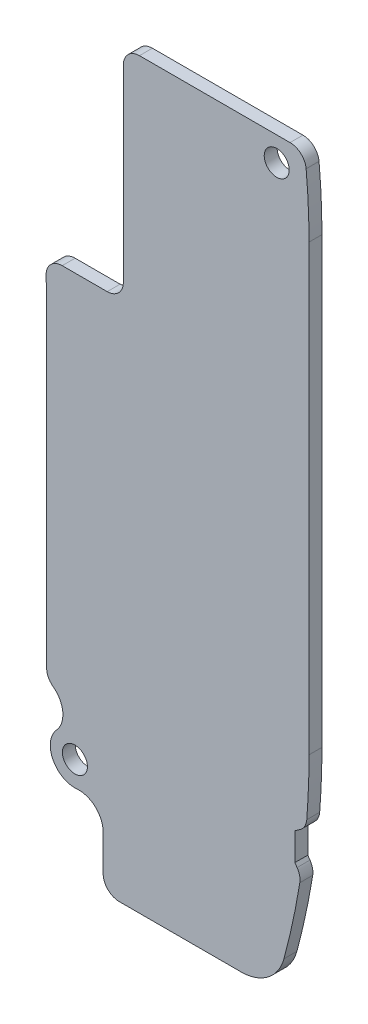
ISO-10303-21;
HEADER;
FILE_DESCRIPTION(('STEP AP214'),'2;1');
FILE_NAME('part.step','',(''),(''),'','','');
FILE_SCHEMA(('AUTOMOTIVE_DESIGN { 1 0 10303 214 1 1 1 1 }'));
ENDSEC;
DATA;
#1=APPLICATION_CONTEXT('core data for automotive mechanical design processes');
#2=APPLICATION_PROTOCOL_DEFINITION('international standard','automotive_design',2000,#1);
#3=PRODUCT_CONTEXT('',#1,'mechanical');
#4=PRODUCT('Part','Part','',(#3));
#5=PRODUCT_RELATED_PRODUCT_CATEGORY('part','',(#4));
#6=PRODUCT_DEFINITION_FORMATION('','',#4);
#7=PRODUCT_DEFINITION_CONTEXT('part definition',#1,'design');
#8=PRODUCT_DEFINITION('design','',#6,#7);
#9=PRODUCT_DEFINITION_SHAPE('','',#8);
#10=(LENGTH_UNIT() NAMED_UNIT(*) SI_UNIT(.MILLI.,.METRE.));
#11=(NAMED_UNIT(*) PLANE_ANGLE_UNIT() SI_UNIT($,.RADIAN.));
#12=(NAMED_UNIT(*) SI_UNIT($,.STERADIAN.) SOLID_ANGLE_UNIT());
#13=UNCERTAINTY_MEASURE_WITH_UNIT(LENGTH_MEASURE(1.E-05),#10,'distance_accuracy_value','');
#14=(GEOMETRIC_REPRESENTATION_CONTEXT(3) GLOBAL_UNCERTAINTY_ASSIGNED_CONTEXT((#13)) GLOBAL_UNIT_ASSIGNED_CONTEXT((#10,
#11,#12)) REPRESENTATION_CONTEXT('',''));
#15=CARTESIAN_POINT('',(0.,0.,0.));
#16=DIRECTION('',(0.,0.,1.));
#17=DIRECTION('',(1.,0.,0.));
#18=AXIS2_PLACEMENT_3D('',#15,#16,#17);
#19=CARTESIAN_POINT('',(0.,-59.,-0.7));
#20=DIRECTION('',(0.,1.,0.));
#21=DIRECTION('',(0.,0.,1.));
#22=AXIS2_PLACEMENT_3D('',#19,#20,#21);
#23=PLANE('',#22);
#24=DIRECTION('',(-1.,0.,0.));
#25=VECTOR('',#24,1.);
#26=CARTESIAN_POINT('',(0.,-59.,0.9));
#27=LINE('',#26,#25);
#28=CARTESIAN_POINT('',(11.5858443604036,-59.,0.9));
#29=VERTEX_POINT('',#28);
#30=CARTESIAN_POINT('',(-3.49999999999999,-59.,0.9));
#31=VERTEX_POINT('',#30);
#32=EDGE_CURVE('E280',#29,#31,#27,.T.);
#33=ORIENTED_EDGE('',*,*,#32,.T.);
#34=DIRECTION('',(0.,0.,1.));
#35=VECTOR('',#34,1.);
#36=CARTESIAN_POINT('',(-3.49999999999999,-59.,-0.7));
#37=LINE('',#36,#35);
#38=CARTESIAN_POINT('',(-3.49999999999999,-59.,-0.7));
#39=VERTEX_POINT('',#38);
#40=EDGE_CURVE('E362',#31,#39,#37,.F.);
#41=ORIENTED_EDGE('',*,*,#40,.T.);
#42=DIRECTION('',(-1.,0.,0.));
#43=VECTOR('',#42,1.);
#44=CARTESIAN_POINT('',(0.,-59.,-0.7));
#45=LINE('',#44,#43);
#46=CARTESIAN_POINT('',(11.5858443604036,-59.,-0.7));
#47=VERTEX_POINT('',#46);
#48=EDGE_CURVE('E231',#47,#39,#45,.T.);
#49=ORIENTED_EDGE('',*,*,#48,.F.);
#50=DIRECTION('',(0.,0.,1.));
#51=VECTOR('',#50,1.);
#52=CARTESIAN_POINT('',(11.5858443604036,-59.,-0.7));
#53=LINE('',#52,#51);
#54=EDGE_CURVE('E273',#47,#29,#53,.T.);
#55=ORIENTED_EDGE('',*,*,#54,.T.);
#56=EDGE_LOOP('',(#33,#41,#49,#55));
#57=FACE_BOUND('',#56,.T.);
#58=ADVANCED_FACE('F35',(#57),#23,.F.);
#59=CARTESIAN_POINT('',(-5.50000000000001,0.,-0.7));
#60=DIRECTION('',(-1.,0.,0.));
#61=DIRECTION('',(0.,-1.,0.));
#62=AXIS2_PLACEMENT_3D('',#59,#60,#61);
#63=PLANE('',#62);
#64=DIRECTION('',(0.,-1.,0.));
#65=VECTOR('',#64,1.);
#66=CARTESIAN_POINT('',(-5.50000000000001,0.,-0.7));
#67=LINE('',#66,#65);
#68=CARTESIAN_POINT('',(-5.49999999999999,-52.5293034423555,-0.7));
#69=VERTEX_POINT('',#68);
#70=CARTESIAN_POINT('',(-5.49999999999999,-57.,-0.7));
#71=VERTEX_POINT('',#70);
#72=EDGE_CURVE('E213',#69,#71,#67,.T.);
#73=ORIENTED_EDGE('',*,*,#72,.T.);
#74=DIRECTION('',(0.,0.,1.));
#75=VECTOR('',#74,1.);
#76=CARTESIAN_POINT('',(-5.49999999999999,-57.,0.9));
#77=LINE('',#76,#75);
#78=CARTESIAN_POINT('',(-5.49999999999999,-57.,0.9));
#79=VERTEX_POINT('',#78);
#80=EDGE_CURVE('E221',#71,#79,#77,.T.);
#81=ORIENTED_EDGE('',*,*,#80,.T.);
#82=DIRECTION('',(0.,-1.,0.));
#83=VECTOR('',#82,1.);
#84=CARTESIAN_POINT('',(-5.50000000000001,0.,0.9));
#85=LINE('',#84,#83);
#86=CARTESIAN_POINT('',(-5.49999999999999,-52.5293034423555,0.9));
#87=VERTEX_POINT('',#86);
#88=EDGE_CURVE('E216',#87,#79,#85,.T.);
#89=ORIENTED_EDGE('',*,*,#88,.F.);
#90=DIRECTION('',(0.,0.,1.));
#91=VECTOR('',#90,1.);
#92=CARTESIAN_POINT('',(-5.49999999999999,-52.5293034423555,-0.7));
#93=LINE('',#92,#91);
#94=EDGE_CURVE('E209',#69,#87,#93,.T.);
#95=ORIENTED_EDGE('',*,*,#94,.F.);
#96=EDGE_LOOP('',(#73,#81,#89,#95));
#97=FACE_BOUND('',#96,.T.);
#98=ADVANCED_FACE('F211',(#97),#63,.T.);
#99=CARTESIAN_POINT('',(-8.49999999999999,-52.5293034423555,-0.7));
#100=DIRECTION('',(0.,0.,1.));
#101=DIRECTION('',(1.,0.,0.));
#102=AXIS2_PLACEMENT_3D('',#99,#100,#101);
#103=CYLINDRICAL_SURFACE('',#102,3.);
#104=CARTESIAN_POINT('',(-8.49999999999999,-52.5293034423555,0.9));
#105=DIRECTION('',(0.,0.,-1.));
#106=DIRECTION('',(-1.,0.,0.));
#107=AXIS2_PLACEMENT_3D('',#104,#105,#106);
#108=CIRCLE('',#107,3.);
#109=CARTESIAN_POINT('',(-8.74793388429751,-49.5395661982123,0.9));
#110=VERTEX_POINT('',#109);
#111=EDGE_CURVE('E284',#110,#87,#108,.T.);
#112=ORIENTED_EDGE('',*,*,#111,.F.);
#113=DIRECTION('',(0.,0.,1.));
#114=VECTOR('',#113,1.);
#115=CARTESIAN_POINT('',(-8.74793388429751,-49.5395661982123,-0.7));
#116=LINE('',#115,#114);
#117=CARTESIAN_POINT('',(-8.74793388429751,-49.5395661982123,-0.7));
#118=VERTEX_POINT('',#117);
#119=EDGE_CURVE('E222',#118,#110,#116,.T.);
#120=ORIENTED_EDGE('',*,*,#119,.F.);
#121=CARTESIAN_POINT('',(-8.49999999999999,-52.5293034423555,-0.7));
#122=DIRECTION('',(0.,0.,-1.));
#123=DIRECTION('',(-1.,0.,0.));
#124=AXIS2_PLACEMENT_3D('',#121,#122,#123);
#125=CIRCLE('',#124,3.);
#126=EDGE_CURVE('E228',#118,#69,#125,.T.);
#127=ORIENTED_EDGE('',*,*,#126,.T.);
#128=ORIENTED_EDGE('',*,*,#94,.T.);
#129=EDGE_LOOP('',(#112,#120,#127,#128));
#130=FACE_BOUND('',#129,.T.);
#131=ADVANCED_FACE('F233',(#130),#103,.F.);
#132=CARTESIAN_POINT('',(-8.99999999999999,-46.5,-0.7));
#133=DIRECTION('',(0.,0.,1.));
#134=DIRECTION('',(1.,0.,0.));
#135=AXIS2_PLACEMENT_3D('',#132,#133,#134);
#136=CYLINDRICAL_SURFACE('',#135,3.05);
#137=CARTESIAN_POINT('',(-8.99999999999999,-46.5,0.9));
#138=DIRECTION('',(0.,0.,-1.));
#139=DIRECTION('',(-1.,0.,0.));
#140=AXIS2_PLACEMENT_3D('',#137,#138,#139);
#141=CIRCLE('',#140,3.05);
#142=CARTESIAN_POINT('',(-11.262273065464,-44.4543654829672,0.9));
#143=VERTEX_POINT('',#142);
#144=EDGE_CURVE('E286',#110,#143,#141,.T.);
#145=ORIENTED_EDGE('',*,*,#144,.T.);
#146=DIRECTION('',(0.,0.,1.));
#147=VECTOR('',#146,1.);
#148=CARTESIAN_POINT('',(-11.262273065464,-44.4543654829672,-0.7));
#149=LINE('',#148,#147);
#150=CARTESIAN_POINT('',(-11.262273065464,-44.4543654829672,-0.7));
#151=VERTEX_POINT('',#150);
#152=EDGE_CURVE('E343',#151,#143,#149,.T.);
#153=ORIENTED_EDGE('',*,*,#152,.F.);
#154=CARTESIAN_POINT('',(-8.99999999999999,-46.5,-0.7));
#155=DIRECTION('',(0.,0.,-1.));
#156=DIRECTION('',(-1.,0.,0.));
#157=AXIS2_PLACEMENT_3D('',#154,#155,#156);
#158=CIRCLE('',#157,3.05);
#159=EDGE_CURVE('E235',#118,#151,#158,.T.);
#160=ORIENTED_EDGE('',*,*,#159,.F.);
#161=ORIENTED_EDGE('',*,*,#119,.T.);
#162=EDGE_LOOP('',(#145,#153,#160,#161));
#163=FACE_BOUND('',#162,.T.);
#164=ADVANCED_FACE('F696',(#163),#136,.T.);
#165=CARTESIAN_POINT('',(-13.4874596872319,-42.4422659580169,-0.7));
#166=DIRECTION('',(0.,0.,1.));
#167=DIRECTION('',(1.,0.,0.));
#168=AXIS2_PLACEMENT_3D('',#165,#166,#167);
#169=CYLINDRICAL_SURFACE('',#168,3.);
#170=CARTESIAN_POINT('',(-13.4874596872319,-42.4422659580169,0.9));
#171=DIRECTION('',(0.,0.,-1.));
#172=DIRECTION('',(-1.,0.,0.));
#173=AXIS2_PLACEMENT_3D('',#170,#171,#172);
#174=CIRCLE('',#173,3.);
#175=CARTESIAN_POINT('',(-11.6949838748928,-40.0366412029524,0.9));
#176=VERTEX_POINT('',#175);
#177=EDGE_CURVE('E289',#176,#143,#174,.T.);
#178=ORIENTED_EDGE('',*,*,#177,.F.);
#179=DIRECTION('',(0.,0.,1.));
#180=VECTOR('',#179,1.);
#181=CARTESIAN_POINT('',(-11.6949838748928,-40.0366412029524,-0.7));
#182=LINE('',#181,#180);
#183=CARTESIAN_POINT('',(-11.6949838748928,-40.0366412029524,-0.7));
#184=VERTEX_POINT('',#183);
#185=EDGE_CURVE('E388',#176,#184,#182,.F.);
#186=ORIENTED_EDGE('',*,*,#185,.T.);
#187=CARTESIAN_POINT('',(-13.4874596872319,-42.4422659580169,-0.7));
#188=DIRECTION('',(0.,0.,-1.));
#189=DIRECTION('',(-1.,0.,0.));
#190=AXIS2_PLACEMENT_3D('',#187,#188,#189);
#191=CIRCLE('',#190,3.);
#192=EDGE_CURVE('E237',#184,#151,#191,.T.);
#193=ORIENTED_EDGE('',*,*,#192,.T.);
#194=ORIENTED_EDGE('',*,*,#152,.T.);
#195=EDGE_LOOP('',(#178,#186,#193,#194));
#196=FACE_BOUND('',#195,.T.);
#197=ADVANCED_FACE('F686',(#196),#169,.F.);
#198=CARTESIAN_POINT('',(-12.5,0.,-0.7));
#199=DIRECTION('',(1.,0.,0.));
#200=DIRECTION('',(0.,0.,-1.));
#201=AXIS2_PLACEMENT_3D('',#198,#199,#200);
#202=PLANE('',#201);
#203=DIRECTION('',(0.,1.,0.));
#204=VECTOR('',#203,1.);
#205=CARTESIAN_POINT('',(-12.5,0.,-0.7));
#206=LINE('',#205,#204);
#207=CARTESIAN_POINT('',(-12.5,-38.4328913662427,-0.7));
#208=VERTEX_POINT('',#207);
#209=CARTESIAN_POINT('',(-12.5,0.,-0.7));
#210=VERTEX_POINT('',#209);
#211=EDGE_CURVE('E242',#208,#210,#206,.T.);
#212=ORIENTED_EDGE('',*,*,#211,.F.);
#213=DIRECTION('',(0.,0.,-1.));
#214=VECTOR('',#213,1.);
#215=CARTESIAN_POINT('',(-12.5,-38.4328913662427,0.9));
#216=LINE('',#215,#214);
#217=CARTESIAN_POINT('',(-12.5,-38.4328913662427,0.9));
#218=VERTEX_POINT('',#217);
#219=EDGE_CURVE('E385',#208,#218,#216,.F.);
#220=ORIENTED_EDGE('',*,*,#219,.T.);
#221=DIRECTION('',(0.,1.,0.));
#222=VECTOR('',#221,1.);
#223=CARTESIAN_POINT('',(-12.5,0.,0.9));
#224=LINE('',#223,#222);
#225=CARTESIAN_POINT('',(-12.5,0.,0.9));
#226=VERTEX_POINT('',#225);
#227=EDGE_CURVE('E291',#218,#226,#224,.T.);
#228=ORIENTED_EDGE('',*,*,#227,.T.);
#229=DIRECTION('',(0.,0.,1.));
#230=VECTOR('',#229,1.);
#231=CARTESIAN_POINT('',(-12.5,0.,-0.7));
#232=LINE('',#231,#230);
#233=EDGE_CURVE('E340',#210,#226,#232,.T.);
#234=ORIENTED_EDGE('',*,*,#233,.F.);
#235=EDGE_LOOP('',(#212,#220,#228,#234));
#236=FACE_BOUND('',#235,.T.);
#237=ADVANCED_FACE('F676',(#236),#202,.F.);
#238=CARTESIAN_POINT('',(-102.5,0.,-0.7));
#239=DIRECTION('',(0.,0.,1.));
#240=DIRECTION('',(1.,0.,0.));
#241=AXIS2_PLACEMENT_3D('',#238,#239,#240);
#242=CYLINDRICAL_SURFACE('',#241,90.);
#243=CARTESIAN_POINT('',(-102.5,0.,0.9));
#244=DIRECTION('',(0.,0.,-1.));
#245=DIRECTION('',(-1.,0.,0.));
#246=AXIS2_PLACEMENT_3D('',#243,#244,#245);
#247=CIRCLE('',#246,90.);
#248=CARTESIAN_POINT('',(-12.5723245793253,3.60738041156953,0.9));
#249=VERTEX_POINT('',#248);
#250=EDGE_CURVE('E293',#249,#226,#247,.T.);
#251=ORIENTED_EDGE('',*,*,#250,.F.);
#252=DIRECTION('',(0.,0.,1.));
#253=VECTOR('',#252,1.);
#254=CARTESIAN_POINT('',(-12.5723245793253,3.60738041156952,-0.7));
#255=LINE('',#254,#253);
#256=CARTESIAN_POINT('',(-12.5723245793253,3.60738041156953,-0.7));
#257=VERTEX_POINT('',#256);
#258=EDGE_CURVE('E395',#249,#257,#255,.F.);
#259=ORIENTED_EDGE('',*,*,#258,.T.);
#260=CARTESIAN_POINT('',(-102.5,0.,-0.7));
#261=DIRECTION('',(0.,0.,-1.));
#262=DIRECTION('',(-1.,0.,0.));
#263=AXIS2_PLACEMENT_3D('',#260,#261,#262);
#264=CIRCLE('',#263,90.);
#265=EDGE_CURVE('E245',#257,#210,#264,.T.);
#266=ORIENTED_EDGE('',*,*,#265,.T.);
#267=ORIENTED_EDGE('',*,*,#233,.T.);
#268=EDGE_LOOP('',(#251,#259,#266,#267));
#269=FACE_BOUND('',#268,.T.);
#270=ADVANCED_FACE('F667',(#269),#242,.F.);
#271=CARTESIAN_POINT('',(0.,5.68754442071549,-0.7));
#272=DIRECTION('',(0.,-1.,0.));
#273=DIRECTION('',(1.,0.,0.));
#274=AXIS2_PLACEMENT_3D('',#271,#272,#273);
#275=PLANE('',#274);
#276=DIRECTION('',(1.,0.,0.));
#277=VECTOR('',#276,1.);
#278=CARTESIAN_POINT('',(0.,5.68754442071549,-0.7));
#279=LINE('',#278,#277);
#280=CARTESIAN_POINT('',(-10.5739317921992,5.68754442071551,-0.7));
#281=VERTEX_POINT('',#280);
#282=CARTESIAN_POINT('',(-5.,5.6875444207155,-0.7));
#283=VERTEX_POINT('',#282);
#284=EDGE_CURVE('E247',#281,#283,#279,.T.);
#285=ORIENTED_EDGE('',*,*,#284,.F.);
#286=DIRECTION('',(0.,0.,-1.));
#287=VECTOR('',#286,1.);
#288=CARTESIAN_POINT('',(-10.5739317921992,5.68754442071551,0.9));
#289=LINE('',#288,#287);
#290=CARTESIAN_POINT('',(-10.5739317921992,5.68754442071551,0.9));
#291=VERTEX_POINT('',#290);
#292=EDGE_CURVE('E392',#281,#291,#289,.F.);
#293=ORIENTED_EDGE('',*,*,#292,.T.);
#294=DIRECTION('',(1.,0.,0.));
#295=VECTOR('',#294,1.);
#296=CARTESIAN_POINT('',(0.,5.68754442071549,0.9));
#297=LINE('',#296,#295);
#298=CARTESIAN_POINT('',(-5.,5.6875444207155,0.9));
#299=VERTEX_POINT('',#298);
#300=EDGE_CURVE('E296',#291,#299,#297,.T.);
#301=ORIENTED_EDGE('',*,*,#300,.T.);
#302=DIRECTION('',(0.,0.,1.));
#303=VECTOR('',#302,1.);
#304=CARTESIAN_POINT('',(-5.,5.6875444207155,-0.7));
#305=LINE('',#304,#303);
#306=EDGE_CURVE('E390',#299,#283,#305,.F.);
#307=ORIENTED_EDGE('',*,*,#306,.T.);
#308=EDGE_LOOP('',(#285,#293,#301,#307));
#309=FACE_BOUND('',#308,.T.);
#310=ADVANCED_FACE('F418',(#309),#275,.F.);
#311=CARTESIAN_POINT('',(-3.,0.,-0.7));
#312=DIRECTION('',(1.,0.,0.));
#313=DIRECTION('',(0.,1.,0.));
#314=AXIS2_PLACEMENT_3D('',#311,#312,#313);
#315=PLANE('',#314);
#316=DIRECTION('',(0.,1.,0.));
#317=VECTOR('',#316,1.);
#318=CARTESIAN_POINT('',(-3.,0.,-0.7));
#319=LINE('',#318,#317);
#320=CARTESIAN_POINT('',(-3.,7.6875444207155,-0.7));
#321=VERTEX_POINT('',#320);
#322=CARTESIAN_POINT('',(-3.,31.,-0.7));
#323=VERTEX_POINT('',#322);
#324=EDGE_CURVE('E250',#321,#323,#319,.T.);
#325=ORIENTED_EDGE('',*,*,#324,.F.);
#326=DIRECTION('',(0.,0.,1.));
#327=VECTOR('',#326,1.);
#328=CARTESIAN_POINT('',(-3.,7.6875444207155,0.9));
#329=LINE('',#328,#327);
#330=CARTESIAN_POINT('',(-3.,7.6875444207155,0.9));
#331=VERTEX_POINT('',#330);
#332=EDGE_CURVE('E399',#321,#331,#329,.T.);
#333=ORIENTED_EDGE('',*,*,#332,.T.);
#334=DIRECTION('',(0.,1.,0.));
#335=VECTOR('',#334,1.);
#336=CARTESIAN_POINT('',(-3.,0.,0.9));
#337=LINE('',#336,#335);
#338=CARTESIAN_POINT('',(-3.,31.,0.9));
#339=VERTEX_POINT('',#338);
#340=EDGE_CURVE('E299',#331,#339,#337,.T.);
#341=ORIENTED_EDGE('',*,*,#340,.T.);
#342=DIRECTION('',(0.,0.,1.));
#343=VECTOR('',#342,1.);
#344=CARTESIAN_POINT('',(-3.,31.,-0.7));
#345=LINE('',#344,#343);
#346=EDGE_CURVE('E397',#339,#323,#345,.F.);
#347=ORIENTED_EDGE('',*,*,#346,.T.);
#348=EDGE_LOOP('',(#325,#333,#341,#347));
#349=FACE_BOUND('',#348,.T.);
#350=ADVANCED_FACE('F425',(#349),#315,.F.);
#351=CARTESIAN_POINT('',(0.,33.,-0.7));
#352=DIRECTION('',(0.,-1.,0.));
#353=DIRECTION('',(0.,0.,-1.));
#354=AXIS2_PLACEMENT_3D('',#351,#352,#353);
#355=PLANE('',#354);
#356=DIRECTION('',(1.,0.,0.));
#357=VECTOR('',#356,1.);
#358=CARTESIAN_POINT('',(0.,33.,-0.7));
#359=LINE('',#358,#357);
#360=CARTESIAN_POINT('',(-0.999999999999999,33.,-0.7));
#361=VERTEX_POINT('',#360);
#362=CARTESIAN_POINT('',(17.6498596380555,33.,-0.7));
#363=VERTEX_POINT('',#362);
#364=EDGE_CURVE('E253',#361,#363,#359,.T.);
#365=ORIENTED_EDGE('',*,*,#364,.F.);
#366=DIRECTION('',(0.,0.,1.));
#367=VECTOR('',#366,1.);
#368=CARTESIAN_POINT('',(-0.999999999999999,33.,-0.7));
#369=LINE('',#368,#367);
#370=CARTESIAN_POINT('',(-0.999999999999999,33.,0.9));
#371=VERTEX_POINT('',#370);
#372=EDGE_CURVE('E404',#361,#371,#369,.T.);
#373=ORIENTED_EDGE('',*,*,#372,.T.);
#374=DIRECTION('',(1.,0.,0.));
#375=VECTOR('',#374,1.);
#376=CARTESIAN_POINT('',(0.,33.,0.9));
#377=LINE('',#376,#375);
#378=CARTESIAN_POINT('',(17.6498596380555,33.,0.9));
#379=VERTEX_POINT('',#378);
#380=EDGE_CURVE('E302',#371,#379,#377,.T.);
#381=ORIENTED_EDGE('',*,*,#380,.T.);
#382=DIRECTION('',(0.,0.,1.));
#383=VECTOR('',#382,1.);
#384=CARTESIAN_POINT('',(17.6498596380555,33.,-0.7));
#385=LINE('',#384,#383);
#386=EDGE_CURVE('E402',#379,#363,#385,.F.);
#387=ORIENTED_EDGE('',*,*,#386,.T.);
#388=EDGE_LOOP('',(#365,#373,#381,#387));
#389=FACE_BOUND('',#388,.T.);
#390=ADVANCED_FACE('F433',(#389),#355,.F.);
#391=CARTESIAN_POINT('',(-62.5,23.5,-0.7));
#392=DIRECTION('',(0.,0.,1.));
#393=DIRECTION('',(1.,0.,0.));
#394=AXIS2_PLACEMENT_3D('',#391,#392,#393);
#395=CYLINDRICAL_SURFACE('',#394,82.5);
#396=CARTESIAN_POINT('',(-62.5,23.5,-0.7));
#397=DIRECTION('',(0.,0.,-1.));
#398=DIRECTION('',(-1.,0.,0.));
#399=AXIS2_PLACEMENT_3D('',#396,#397,#398);
#400=CIRCLE('',#399,82.5);
#401=CARTESIAN_POINT('',(19.6411604986283,31.1863354037267,-0.7));
#402=VERTEX_POINT('',#401);
#403=CARTESIAN_POINT('',(20.,23.5,-0.7));
#404=VERTEX_POINT('',#403);
#405=EDGE_CURVE('E256',#402,#404,#400,.T.);
#406=ORIENTED_EDGE('',*,*,#405,.F.);
#407=DIRECTION('',(0.,0.,1.));
#408=VECTOR('',#407,1.);
#409=CARTESIAN_POINT('',(19.6411604986283,31.1863354037267,-0.7));
#410=LINE('',#409,#408);
#411=CARTESIAN_POINT('',(19.6411604986283,31.1863354037267,0.9));
#412=VERTEX_POINT('',#411);
#413=EDGE_CURVE('E407',#402,#412,#410,.T.);
#414=ORIENTED_EDGE('',*,*,#413,.T.);
#415=CARTESIAN_POINT('',(-62.5,23.5,0.9));
#416=DIRECTION('',(0.,0.,-1.));
#417=DIRECTION('',(-1.,0.,0.));
#418=AXIS2_PLACEMENT_3D('',#415,#416,#417);
#419=CIRCLE('',#418,82.5);
#420=CARTESIAN_POINT('',(20.,23.5,0.9));
#421=VERTEX_POINT('',#420);
#422=EDGE_CURVE('E305',#412,#421,#419,.T.);
#423=ORIENTED_EDGE('',*,*,#422,.T.);
#424=DIRECTION('',(0.,0.,1.));
#425=VECTOR('',#424,1.);
#426=CARTESIAN_POINT('',(20.,23.5,-0.7));
#427=LINE('',#426,#425);
#428=EDGE_CURVE('E337',#404,#421,#427,.T.);
#429=ORIENTED_EDGE('',*,*,#428,.F.);
#430=EDGE_LOOP('',(#406,#414,#423,#429));
#431=FACE_BOUND('',#430,.T.);
#432=ADVANCED_FACE('F441',(#431),#395,.T.);
#433=CARTESIAN_POINT('',(20.,0.,-0.7));
#434=DIRECTION('',(-1.,0.,0.));
#435=DIRECTION('',(0.,-1.,0.));
#436=AXIS2_PLACEMENT_3D('',#433,#434,#435);
#437=PLANE('',#436);
#438=DIRECTION('',(0.,-1.,0.));
#439=VECTOR('',#438,1.);
#440=CARTESIAN_POINT('',(20.,0.,0.9));
#441=LINE('',#440,#439);
#442=CARTESIAN_POINT('',(20.,-31.5,0.9));
#443=VERTEX_POINT('',#442);
#444=EDGE_CURVE('E307',#421,#443,#441,.T.);
#445=ORIENTED_EDGE('',*,*,#444,.T.);
#446=DIRECTION('',(0.,0.,1.));
#447=VECTOR('',#446,1.);
#448=CARTESIAN_POINT('',(20.,-31.5,-0.7));
#449=LINE('',#448,#447);
#450=CARTESIAN_POINT('',(20.,-31.5,-0.7));
#451=VERTEX_POINT('',#450);
#452=EDGE_CURVE('E334',#451,#443,#449,.T.);
#453=ORIENTED_EDGE('',*,*,#452,.F.);
#454=DIRECTION('',(0.,-1.,0.));
#455=VECTOR('',#454,1.);
#456=CARTESIAN_POINT('',(20.,0.,-0.7));
#457=LINE('',#456,#455);
#458=EDGE_CURVE('E258',#404,#451,#457,.T.);
#459=ORIENTED_EDGE('',*,*,#458,.F.);
#460=ORIENTED_EDGE('',*,*,#428,.T.);
#461=EDGE_LOOP('',(#445,#453,#459,#460));
#462=FACE_BOUND('',#461,.T.);
#463=ADVANCED_FACE('F447',(#462),#437,.F.);
#464=CARTESIAN_POINT('',(-70.0000000000003,-31.5,-0.7));
#465=DIRECTION('',(0.,0.,1.));
#466=DIRECTION('',(1.,0.,0.));
#467=AXIS2_PLACEMENT_3D('',#464,#465,#466);
#468=CYLINDRICAL_SURFACE('',#467,90.0000000000003);
#469=CARTESIAN_POINT('',(-70.0000000000003,-31.5,0.9));
#470=DIRECTION('',(0.,0.,-1.));
#471=DIRECTION('',(-1.,0.,0.));
#472=AXIS2_PLACEMENT_3D('',#469,#470,#471);
#473=CIRCLE('',#472,90.0000000000003);
#474=CARTESIAN_POINT('',(19.7192344746659,-38.6034474221972,0.9));
#475=VERTEX_POINT('',#474);
#476=EDGE_CURVE('E309',#443,#475,#473,.T.);
#477=ORIENTED_EDGE('',*,*,#476,.T.);
#478=DIRECTION('',(0.,0.,1.));
#479=VECTOR('',#478,1.);
#480=CARTESIAN_POINT('',(19.7192344746659,-38.6034474221972,-0.7));
#481=LINE('',#480,#479);
#482=CARTESIAN_POINT('',(19.7192344746659,-38.6034474221972,-0.7));
#483=VERTEX_POINT('',#482);
#484=EDGE_CURVE('E383',#475,#483,#481,.F.);
#485=ORIENTED_EDGE('',*,*,#484,.T.);
#486=CARTESIAN_POINT('',(-70.0000000000003,-31.5,-0.7));
#487=DIRECTION('',(0.,0.,-1.));
#488=DIRECTION('',(-1.,0.,0.));
#489=AXIS2_PLACEMENT_3D('',#486,#487,#488);
#490=CIRCLE('',#489,90.0000000000003);
#491=EDGE_CURVE('E260',#451,#483,#490,.T.);
#492=ORIENTED_EDGE('',*,*,#491,.F.);
#493=ORIENTED_EDGE('',*,*,#452,.T.);
#494=EDGE_LOOP('',(#477,#485,#492,#493));
#495=FACE_BOUND('',#494,.T.);
#496=ADVANCED_FACE('F624',(#495),#468,.T.);
#497=CARTESIAN_POINT('',(25.0421752362054,-35.763932648074,-0.7));
#498=DIRECTION('',(-0.573576436351039,0.819152044288996,0.));
#499=DIRECTION('',(-0.819152044288996,-0.573576436351039,0.));
#500=AXIS2_PLACEMENT_3D('',#497,#498,#499);
#501=PLANE('',#500);
#502=DIRECTION('',(-0.819152044288996,-0.573576436351039,0.));
#503=VECTOR('',#502,1.);
#504=CARTESIAN_POINT('',(25.0421752362054,-35.763932648074,-0.7));
#505=LINE('',#504,#503);
#506=CARTESIAN_POINT('',(18.8726265812643,-40.0838971236153,-0.7));
#507=VERTEX_POINT('',#506);
#508=CARTESIAN_POINT('',(18.2474075308823,-40.5216802157251,-0.7));
#509=VERTEX_POINT('',#508);
#510=EDGE_CURVE('E263',#507,#509,#505,.T.);
#511=ORIENTED_EDGE('',*,*,#510,.F.);
#512=DIRECTION('',(0.,0.,1.));
#513=VECTOR('',#512,1.);
#514=CARTESIAN_POINT('',(18.8726265812643,-40.0838971236153,-0.7));
#515=LINE('',#514,#513);
#516=CARTESIAN_POINT('',(18.8726265812643,-40.0838971236153,0.9));
#517=VERTEX_POINT('',#516);
#518=EDGE_CURVE('E380',#507,#517,#515,.T.);
#519=ORIENTED_EDGE('',*,*,#518,.T.);
#520=DIRECTION('',(-0.819152044288996,-0.573576436351039,0.));
#521=VECTOR('',#520,1.);
#522=CARTESIAN_POINT('',(25.0421752362054,-35.763932648074,0.9));
#523=LINE('',#522,#521);
#524=CARTESIAN_POINT('',(18.2474075308823,-40.5216802157251,0.9));
#525=VERTEX_POINT('',#524);
#526=EDGE_CURVE('E312',#517,#525,#523,.T.);
#527=ORIENTED_EDGE('',*,*,#526,.T.);
#528=DIRECTION('',(0.,0.,1.));
#529=VECTOR('',#528,1.);
#530=CARTESIAN_POINT('',(18.2474075308823,-40.5216802157251,-0.7));
#531=LINE('',#530,#529);
#532=EDGE_CURVE('E331',#509,#525,#531,.T.);
#533=ORIENTED_EDGE('',*,*,#532,.F.);
#534=EDGE_LOOP('',(#511,#519,#527,#533));
#535=FACE_BOUND('',#534,.T.);
#536=ADVANCED_FACE('F458',(#535),#501,.F.);
#537=CARTESIAN_POINT('',(18.2474075308823,0.,-0.7));
#538=DIRECTION('',(-1.,0.,0.));
#539=DIRECTION('',(0.,0.,1.));
#540=AXIS2_PLACEMENT_3D('',#537,#538,#539);
#541=PLANE('',#540);
#542=DIRECTION('',(0.,-1.,0.));
#543=VECTOR('',#542,1.);
#544=CARTESIAN_POINT('',(18.2474075308823,0.,0.9));
#545=LINE('',#544,#543);
#546=CARTESIAN_POINT('',(18.2474075308823,-43.9396131354404,0.9));
#547=VERTEX_POINT('',#546);
#548=EDGE_CURVE('E314',#525,#547,#545,.T.);
#549=ORIENTED_EDGE('',*,*,#548,.T.);
#550=DIRECTION('',(0.,0.,1.));
#551=VECTOR('',#550,1.);
#552=CARTESIAN_POINT('',(18.2474075308823,-43.9396131354404,-0.7));
#553=LINE('',#552,#551);
#554=CARTESIAN_POINT('',(18.2474075308823,-43.9396131354404,-0.7));
#555=VERTEX_POINT('',#554);
#556=EDGE_CURVE('E328',#555,#547,#553,.T.);
#557=ORIENTED_EDGE('',*,*,#556,.F.);
#558=DIRECTION('',(0.,-1.,0.));
#559=VECTOR('',#558,1.);
#560=CARTESIAN_POINT('',(18.2474075308823,0.,-0.7));
#561=LINE('',#560,#559);
#562=EDGE_CURVE('E265',#509,#555,#561,.T.);
#563=ORIENTED_EDGE('',*,*,#562,.F.);
#564=ORIENTED_EDGE('',*,*,#532,.T.);
#565=EDGE_LOOP('',(#549,#557,#563,#564));
#566=FACE_BOUND('',#565,.T.);
#567=ADVANCED_FACE('F465',(#566),#541,.F.);
#568=CARTESIAN_POINT('',(-8.40067087682232,-5.88221307396981,-0.7));
#569=DIRECTION('',(-0.81915204428899,-0.573576436351049,0.));
#570=DIRECTION('',(0.573576436351049,-0.81915204428899,0.));
#571=AXIS2_PLACEMENT_3D('',#568,#569,#570);
#572=PLANE('',#571);
#573=DIRECTION('',(0.573576436351049,-0.819152044288989,0.));
#574=VECTOR('',#573,1.);
#575=CARTESIAN_POINT('',(-8.40067087682232,-5.88221307396981,0.9));
#576=LINE('',#575,#574);
#577=CARTESIAN_POINT('',(18.5211251414246,-44.3305223953467,0.9));
#578=VERTEX_POINT('',#577);
#579=EDGE_CURVE('E316',#547,#578,#576,.T.);
#580=ORIENTED_EDGE('',*,*,#579,.T.);
#581=DIRECTION('',(0.,0.,1.));
#582=VECTOR('',#581,1.);
#583=CARTESIAN_POINT('',(18.5211251414246,-44.3305223953467,-0.7));
#584=LINE('',#583,#582);
#585=CARTESIAN_POINT('',(18.5211251414246,-44.3305223953467,-0.7));
#586=VERTEX_POINT('',#585);
#587=EDGE_CURVE('E58',#578,#586,#584,.F.);
#588=ORIENTED_EDGE('',*,*,#587,.T.);
#589=DIRECTION('',(0.573576436351049,-0.819152044288989,0.));
#590=VECTOR('',#589,1.);
#591=CARTESIAN_POINT('',(-8.40067087682232,-5.88221307396981,-0.7));
#592=LINE('',#591,#590);
#593=EDGE_CURVE('E267',#555,#586,#592,.T.);
#594=ORIENTED_EDGE('',*,*,#593,.F.);
#595=ORIENTED_EDGE('',*,*,#556,.T.);
#596=EDGE_LOOP('',(#580,#588,#594,#595));
#597=FACE_BOUND('',#596,.T.);
#598=ADVANCED_FACE('F467',(#597),#572,.F.);
#599=CARTESIAN_POINT('',(-70.0000000000003,-31.5,-0.7));
#600=DIRECTION('',(0.,0.,1.));
#601=DIRECTION('',(1.,0.,0.));
#602=AXIS2_PLACEMENT_3D('',#599,#600,#601);
#603=CYLINDRICAL_SURFACE('',#602,90.0000000000003);
#604=CARTESIAN_POINT('',(-70.0000000000003,-31.5,-0.7));
#605=DIRECTION('',(0.,0.,-1.));
#606=DIRECTION('',(-1.,0.,0.));
#607=AXIS2_PLACEMENT_3D('',#604,#605,#606);
#608=CIRCLE('',#607,90.0000000000003);
#609=CARTESIAN_POINT('',(18.8574306222296,-45.795349705959,-0.7));
#610=VERTEX_POINT('',#609);
#611=CARTESIAN_POINT('',(16.8961655909624,-54.9319526627218,-0.7));
#612=VERTEX_POINT('',#611);
#613=EDGE_CURVE('E269',#610,#612,#608,.T.);
#614=ORIENTED_EDGE('',*,*,#613,.F.);
#615=DIRECTION('',(0.,0.,1.));
#616=VECTOR('',#615,1.);
#617=CARTESIAN_POINT('',(18.8574306222296,-45.795349705959,-0.7));
#618=LINE('',#617,#616);
#619=CARTESIAN_POINT('',(18.8574306222296,-45.795349705959,0.9));
#620=VERTEX_POINT('',#619);
#621=EDGE_CURVE('E376',#610,#620,#618,.T.);
#622=ORIENTED_EDGE('',*,*,#621,.T.);
#623=CARTESIAN_POINT('',(-70.0000000000003,-31.5,0.9));
#624=DIRECTION('',(0.,0.,-1.));
#625=DIRECTION('',(-1.,0.,0.));
#626=AXIS2_PLACEMENT_3D('',#623,#624,#625);
#627=CIRCLE('',#626,90.0000000000003);
#628=CARTESIAN_POINT('',(16.8961655909624,-54.9319526627218,0.9));
#629=VERTEX_POINT('',#628);
#630=EDGE_CURVE('E318',#620,#629,#627,.T.);
#631=ORIENTED_EDGE('',*,*,#630,.T.);
#632=DIRECTION('',(0.,0.,1.));
#633=VECTOR('',#632,1.);
#634=CARTESIAN_POINT('',(16.8961655909624,-54.9319526627218,-0.7));
#635=LINE('',#634,#633);
#636=EDGE_CURVE('E325',#612,#629,#635,.T.);
#637=ORIENTED_EDGE('',*,*,#636,.F.);
#638=EDGE_LOOP('',(#614,#622,#631,#637));
#639=FACE_BOUND('',#638,.T.);
#640=ADVANCED_FACE('F473',(#639),#603,.T.);
#641=CARTESIAN_POINT('',(-8.99999999999999,-46.5,-0.7));
#642=DIRECTION('',(0.,0.,1.));
#643=DIRECTION('',(1.,0.,0.));
#644=AXIS2_PLACEMENT_3D('',#641,#642,#643);
#645=CYLINDRICAL_SURFACE('',#644,1.55);
#646=CARTESIAN_POINT('',(-8.99999999999999,-46.5,-0.7));
#647=DIRECTION('',(0.,0.,-1.));
#648=DIRECTION('',(-1.,0.,0.));
#649=AXIS2_PLACEMENT_3D('',#646,#647,#648);
#650=CIRCLE('',#649,1.55);
#651=CARTESIAN_POINT('',(-10.55,-46.5,-0.7));
#652=VERTEX_POINT('',#651);
#653=EDGE_CURVE('E484',#652,#652,#650,.T.);
#654=ORIENTED_EDGE('',*,*,#653,.T.);
#655=EDGE_LOOP('',(#654));
#656=FACE_BOUND('',#655,.T.);
#657=CARTESIAN_POINT('',(-8.99999999999999,-46.5,0.9));
#658=DIRECTION('',(0.,0.,-1.));
#659=DIRECTION('',(-1.,0.,0.));
#660=AXIS2_PLACEMENT_3D('',#657,#658,#659);
#661=CIRCLE('',#660,1.55);
#662=CARTESIAN_POINT('',(-10.55,-46.5,0.9));
#663=VERTEX_POINT('',#662);
#664=EDGE_CURVE('E277',#663,#663,#661,.T.);
#665=ORIENTED_EDGE('',*,*,#664,.F.);
#666=EDGE_LOOP('',(#665));
#667=FACE_BOUND('',#666,.T.);
#668=ADVANCED_FACE('F499',(#656,#667),#645,.F.);
#669=CARTESIAN_POINT('',(16.,30.,-0.7));
#670=DIRECTION('',(0.,0.,1.));
#671=DIRECTION('',(1.,0.,0.));
#672=AXIS2_PLACEMENT_3D('',#669,#670,#671);
#673=CYLINDRICAL_SURFACE('',#672,1.55);
#674=CARTESIAN_POINT('',(16.,30.,-0.7));
#675=DIRECTION('',(0.,0.,-1.));
#676=DIRECTION('',(-1.,0.,0.));
#677=AXIS2_PLACEMENT_3D('',#674,#675,#676);
#678=CIRCLE('',#677,1.55);
#679=CARTESIAN_POINT('',(14.45,30.,-0.7));
#680=VERTEX_POINT('',#679);
#681=EDGE_CURVE('E322',#680,#680,#678,.T.);
#682=ORIENTED_EDGE('',*,*,#681,.T.);
#683=EDGE_LOOP('',(#682));
#684=FACE_BOUND('',#683,.T.);
#685=CARTESIAN_POINT('',(16.,30.,0.9));
#686=DIRECTION('',(0.,0.,-1.));
#687=DIRECTION('',(-1.,0.,0.));
#688=AXIS2_PLACEMENT_3D('',#685,#686,#687);
#689=CIRCLE('',#688,1.55);
#690=CARTESIAN_POINT('',(14.45,30.,0.9));
#691=VERTEX_POINT('',#690);
#692=EDGE_CURVE('E274',#691,#691,#689,.T.);
#693=ORIENTED_EDGE('',*,*,#692,.F.);
#694=EDGE_LOOP('',(#693));
#695=FACE_BOUND('',#694,.T.);
#696=ADVANCED_FACE('F491',(#684,#695),#673,.F.);
#697=CARTESIAN_POINT('',(11.5858443604036,-53.5,-0.7));
#698=DIRECTION('',(0.,0.,1.));
#699=DIRECTION('',(1.,0.,0.));
#700=AXIS2_PLACEMENT_3D('',#697,#698,#699);
#701=CYLINDRICAL_SURFACE('',#700,5.5);
#702=CARTESIAN_POINT('',(11.5858443604036,-53.5,0.9));
#703=DIRECTION('',(0.,0.,-1.));
#704=DIRECTION('',(-1.,0.,0.));
#705=AXIS2_PLACEMENT_3D('',#702,#703,#704);
#706=CIRCLE('',#705,5.5);
#707=EDGE_CURVE('E320',#629,#29,#706,.T.);
#708=ORIENTED_EDGE('',*,*,#707,.T.);
#709=ORIENTED_EDGE('',*,*,#54,.F.);
#710=CARTESIAN_POINT('',(11.5858443604036,-53.5,-0.7));
#711=DIRECTION('',(0.,0.,-1.));
#712=DIRECTION('',(-1.,0.,0.));
#713=AXIS2_PLACEMENT_3D('',#710,#711,#712);
#714=CIRCLE('',#713,5.5);
#715=EDGE_CURVE('E271',#612,#47,#714,.T.);
#716=ORIENTED_EDGE('',*,*,#715,.F.);
#717=ORIENTED_EDGE('',*,*,#636,.T.);
#718=EDGE_LOOP('',(#708,#709,#716,#717));
#719=FACE_BOUND('',#718,.T.);
#720=ADVANCED_FACE('F479',(#719),#701,.T.);
#721=CARTESIAN_POINT('',(0.,0.,-0.7));
#722=DIRECTION('',(0.,0.,-1.));
#723=DIRECTION('',(-1.,0.,0.));
#724=AXIS2_PLACEMENT_3D('',#721,#722,#723);
#725=PLANE('',#724);
#726=ORIENTED_EDGE('',*,*,#681,.F.);
#727=EDGE_LOOP('',(#726));
#728=FACE_BOUND('',#727,.T.);
#729=ORIENTED_EDGE('',*,*,#653,.F.);
#730=EDGE_LOOP('',(#729));
#731=FACE_BOUND('',#730,.T.);
#732=ORIENTED_EDGE('',*,*,#48,.T.);
#733=CARTESIAN_POINT('',(-3.49999999999999,-57.,-0.7));
#734=DIRECTION('',(0.,0.,-1.));
#735=DIRECTION('',(-1.,0.,0.));
#736=AXIS2_PLACEMENT_3D('',#733,#734,#735);
#737=CIRCLE('',#736,2.);
#738=EDGE_CURVE('E230',#39,#71,#737,.T.);
#739=ORIENTED_EDGE('',*,*,#738,.T.);
#740=ORIENTED_EDGE('',*,*,#72,.F.);
#741=ORIENTED_EDGE('',*,*,#126,.F.);
#742=ORIENTED_EDGE('',*,*,#159,.T.);
#743=ORIENTED_EDGE('',*,*,#192,.F.);
#744=CARTESIAN_POINT('',(-10.5,-38.4328913662427,-0.7));
#745=DIRECTION('',(0.,0.,-1.));
#746=DIRECTION('',(-1.,0.,0.));
#747=AXIS2_PLACEMENT_3D('',#744,#745,#746);
#748=CIRCLE('',#747,2.);
#749=EDGE_CURVE('E370',#184,#208,#748,.T.);
#750=ORIENTED_EDGE('',*,*,#749,.T.);
#751=ORIENTED_EDGE('',*,*,#211,.T.);
#752=ORIENTED_EDGE('',*,*,#265,.F.);
#753=CARTESIAN_POINT('',(-10.5739317921992,3.68754442071551,-0.7));
#754=DIRECTION('',(0.,0.,-1.));
#755=DIRECTION('',(-1.,0.,0.));
#756=AXIS2_PLACEMENT_3D('',#753,#754,#755);
#757=CIRCLE('',#756,2.);
#758=EDGE_CURVE('E368',#257,#281,#757,.T.);
#759=ORIENTED_EDGE('',*,*,#758,.T.);
#760=ORIENTED_EDGE('',*,*,#284,.T.);
#761=CARTESIAN_POINT('',(-5.,7.6875444207155,-0.7));
#762=DIRECTION('',(0.,0.,-1.));
#763=DIRECTION('',(-1.,0.,0.));
#764=AXIS2_PLACEMENT_3D('',#761,#762,#763);
#765=CIRCLE('',#764,2.);
#766=EDGE_CURVE('E11',#283,#321,#765,.F.);
#767=ORIENTED_EDGE('',*,*,#766,.T.);
#768=ORIENTED_EDGE('',*,*,#324,.T.);
#769=CARTESIAN_POINT('',(-0.999999999999999,31.,-0.7));
#770=DIRECTION('',(0.,0.,-1.));
#771=DIRECTION('',(-1.,0.,0.));
#772=AXIS2_PLACEMENT_3D('',#769,#770,#771);
#773=CIRCLE('',#772,2.);
#774=EDGE_CURVE('E366',#323,#361,#773,.T.);
#775=ORIENTED_EDGE('',*,*,#774,.T.);
#776=ORIENTED_EDGE('',*,*,#364,.T.);
#777=CARTESIAN_POINT('',(17.6498596380555,31.,-0.7));
#778=DIRECTION('',(0.,0.,-1.));
#779=DIRECTION('',(-1.,0.,0.));
#780=AXIS2_PLACEMENT_3D('',#777,#778,#779);
#781=CIRCLE('',#780,2.);
#782=EDGE_CURVE('E364',#363,#402,#781,.T.);
#783=ORIENTED_EDGE('',*,*,#782,.T.);
#784=ORIENTED_EDGE('',*,*,#405,.T.);
#785=ORIENTED_EDGE('',*,*,#458,.T.);
#786=ORIENTED_EDGE('',*,*,#491,.T.);
#787=CARTESIAN_POINT('',(17.7254737085622,-38.4455930350373,-0.7));
#788=DIRECTION('',(0.,0.,-1.));
#789=DIRECTION('',(-1.,0.,0.));
#790=AXIS2_PLACEMENT_3D('',#787,#788,#789);
#791=CIRCLE('',#790,2.);
#792=EDGE_CURVE('E372',#483,#507,#791,.T.);
#793=ORIENTED_EDGE('',*,*,#792,.T.);
#794=ORIENTED_EDGE('',*,*,#510,.T.);
#795=ORIENTED_EDGE('',*,*,#562,.T.);
#796=ORIENTED_EDGE('',*,*,#593,.T.);
#797=CARTESIAN_POINT('',(16.8828210528467,-45.4776752680488,-0.7));
#798=DIRECTION('',(0.,0.,-1.));
#799=DIRECTION('',(-1.,0.,0.));
#800=AXIS2_PLACEMENT_3D('',#797,#798,#799);
#801=CIRCLE('',#800,2.);
#802=EDGE_CURVE('E50',#586,#610,#801,.T.);
#803=ORIENTED_EDGE('',*,*,#802,.T.);
#804=ORIENTED_EDGE('',*,*,#613,.T.);
#805=ORIENTED_EDGE('',*,*,#715,.T.);
#806=EDGE_LOOP('',(#732,#739,#740,#741,#742,#743,#750,#751,#752,#759,#760,#767,#768,#775,#776,
#783,#784,#785,#786,#793,#794,#795,#796,#803,#804,#805));
#807=FACE_BOUND('',#806,.T.);
#808=ADVANCED_FACE('F226',(#728,#731,#807),#725,.T.);
#809=CARTESIAN_POINT('',(0.,0.,0.9));
#810=DIRECTION('',(0.,0.,-1.));
#811=DIRECTION('',(-1.,0.,0.));
#812=AXIS2_PLACEMENT_3D('',#809,#810,#811);
#813=PLANE('',#812);
#814=ORIENTED_EDGE('',*,*,#692,.T.);
#815=EDGE_LOOP('',(#814));
#816=FACE_BOUND('',#815,.T.);
#817=ORIENTED_EDGE('',*,*,#664,.T.);
#818=EDGE_LOOP('',(#817));
#819=FACE_BOUND('',#818,.T.);
#820=ORIENTED_EDGE('',*,*,#88,.T.);
#821=CARTESIAN_POINT('',(-3.49999999999999,-57.,0.9));
#822=DIRECTION('',(0.,0.,-1.));
#823=DIRECTION('',(-1.,0.,0.));
#824=AXIS2_PLACEMENT_3D('',#821,#822,#823);
#825=CIRCLE('',#824,2.);
#826=EDGE_CURVE('E360',#79,#31,#825,.F.);
#827=ORIENTED_EDGE('',*,*,#826,.T.);
#828=ORIENTED_EDGE('',*,*,#32,.F.);
#829=ORIENTED_EDGE('',*,*,#707,.F.);
#830=ORIENTED_EDGE('',*,*,#630,.F.);
#831=CARTESIAN_POINT('',(16.8828210528467,-45.4776752680488,0.9));
#832=DIRECTION('',(0.,0.,-1.));
#833=DIRECTION('',(-1.,0.,0.));
#834=AXIS2_PLACEMENT_3D('',#831,#832,#833);
#835=CIRCLE('',#834,2.);
#836=EDGE_CURVE('E358',#620,#578,#835,.F.);
#837=ORIENTED_EDGE('',*,*,#836,.T.);
#838=ORIENTED_EDGE('',*,*,#579,.F.);
#839=ORIENTED_EDGE('',*,*,#548,.F.);
#840=ORIENTED_EDGE('',*,*,#526,.F.);
#841=CARTESIAN_POINT('',(17.7254737085622,-38.4455930350373,0.9));
#842=DIRECTION('',(0.,0.,-1.));
#843=DIRECTION('',(-1.,0.,0.));
#844=AXIS2_PLACEMENT_3D('',#841,#842,#843);
#845=CIRCLE('',#844,2.);
#846=EDGE_CURVE('E356',#517,#475,#845,.F.);
#847=ORIENTED_EDGE('',*,*,#846,.T.);
#848=ORIENTED_EDGE('',*,*,#476,.F.);
#849=ORIENTED_EDGE('',*,*,#444,.F.);
#850=ORIENTED_EDGE('',*,*,#422,.F.);
#851=CARTESIAN_POINT('',(17.6498596380555,31.,0.9));
#852=DIRECTION('',(0.,0.,-1.));
#853=DIRECTION('',(-1.,0.,0.));
#854=AXIS2_PLACEMENT_3D('',#851,#852,#853);
#855=CIRCLE('',#854,2.);
#856=EDGE_CURVE('E348',#412,#379,#855,.F.);
#857=ORIENTED_EDGE('',*,*,#856,.T.);
#858=ORIENTED_EDGE('',*,*,#380,.F.);
#859=CARTESIAN_POINT('',(-0.999999999999999,31.,0.9));
#860=DIRECTION('',(0.,0.,-1.));
#861=DIRECTION('',(-1.,0.,0.));
#862=AXIS2_PLACEMENT_3D('',#859,#860,#861);
#863=CIRCLE('',#862,2.);
#864=EDGE_CURVE('E350',#371,#339,#863,.F.);
#865=ORIENTED_EDGE('',*,*,#864,.T.);
#866=ORIENTED_EDGE('',*,*,#340,.F.);
#867=CARTESIAN_POINT('',(-5.,7.6875444207155,0.9));
#868=DIRECTION('',(0.,0.,-1.));
#869=DIRECTION('',(-1.,0.,0.));
#870=AXIS2_PLACEMENT_3D('',#867,#868,#869);
#871=CIRCLE('',#870,2.);
#872=EDGE_CURVE('E43',#331,#299,#871,.T.);
#873=ORIENTED_EDGE('',*,*,#872,.T.);
#874=ORIENTED_EDGE('',*,*,#300,.F.);
#875=CARTESIAN_POINT('',(-10.5739317921992,3.68754442071551,0.9));
#876=DIRECTION('',(0.,0.,-1.));
#877=DIRECTION('',(-1.,0.,0.));
#878=AXIS2_PLACEMENT_3D('',#875,#876,#877);
#879=CIRCLE('',#878,2.);
#880=EDGE_CURVE('E352',#291,#249,#879,.F.);
#881=ORIENTED_EDGE('',*,*,#880,.T.);
#882=ORIENTED_EDGE('',*,*,#250,.T.);
#883=ORIENTED_EDGE('',*,*,#227,.F.);
#884=CARTESIAN_POINT('',(-10.5,-38.4328913662427,0.9));
#885=DIRECTION('',(0.,0.,-1.));
#886=DIRECTION('',(-1.,0.,0.));
#887=AXIS2_PLACEMENT_3D('',#884,#885,#886);
#888=CIRCLE('',#887,2.);
#889=EDGE_CURVE('E354',#218,#176,#888,.F.);
#890=ORIENTED_EDGE('',*,*,#889,.T.);
#891=ORIENTED_EDGE('',*,*,#177,.T.);
#892=ORIENTED_EDGE('',*,*,#144,.F.);
#893=ORIENTED_EDGE('',*,*,#111,.T.);
#894=EDGE_LOOP('',(#820,#827,#828,#829,#830,#837,#838,#839,#840,#847,#848,#849,#850,#857,#858,
#865,#866,#873,#874,#881,#882,#883,#890,#891,#892,#893));
#895=FACE_BOUND('',#894,.T.);
#896=ADVANCED_FACE('F412',(#816,#819,#895),#813,.F.);
#897=CARTESIAN_POINT('',(-3.49999999999999,-57.,-0.7));
#898=DIRECTION('',(0.,0.,-1.));
#899=DIRECTION('',(-1.,0.,0.));
#900=AXIS2_PLACEMENT_3D('',#897,#898,#899);
#901=CYLINDRICAL_SURFACE('',#900,2.);
#902=ORIENTED_EDGE('',*,*,#738,.F.);
#903=ORIENTED_EDGE('',*,*,#40,.F.);
#904=ORIENTED_EDGE('',*,*,#826,.F.);
#905=ORIENTED_EDGE('',*,*,#80,.F.);
#906=EDGE_LOOP('',(#902,#903,#904,#905));
#907=FACE_BOUND('',#906,.T.);
#908=ADVANCED_FACE('F506',(#907),#901,.T.);
#909=CARTESIAN_POINT('',(16.8828210528467,-45.4776752680488,-0.7));
#910=DIRECTION('',(0.,0.,1.));
#911=DIRECTION('',(1.,0.,0.));
#912=AXIS2_PLACEMENT_3D('',#909,#910,#911);
#913=CYLINDRICAL_SURFACE('',#912,2.);
#914=ORIENTED_EDGE('',*,*,#802,.F.);
#915=ORIENTED_EDGE('',*,*,#587,.F.);
#916=ORIENTED_EDGE('',*,*,#836,.F.);
#917=ORIENTED_EDGE('',*,*,#621,.F.);
#918=EDGE_LOOP('',(#914,#915,#916,#917));
#919=FACE_BOUND('',#918,.T.);
#920=ADVANCED_FACE('F470',(#919),#913,.T.);
#921=CARTESIAN_POINT('',(17.7254737085622,-38.4455930350373,-0.7));
#922=DIRECTION('',(0.,0.,1.));
#923=DIRECTION('',(1.,0.,0.));
#924=AXIS2_PLACEMENT_3D('',#921,#922,#923);
#925=CYLINDRICAL_SURFACE('',#924,2.);
#926=ORIENTED_EDGE('',*,*,#792,.F.);
#927=ORIENTED_EDGE('',*,*,#484,.F.);
#928=ORIENTED_EDGE('',*,*,#846,.F.);
#929=ORIENTED_EDGE('',*,*,#518,.F.);
#930=EDGE_LOOP('',(#926,#927,#928,#929));
#931=FACE_BOUND('',#930,.T.);
#932=ADVANCED_FACE('F455',(#931),#925,.T.);
#933=CARTESIAN_POINT('',(-10.5,-38.4328913662427,-0.7));
#934=DIRECTION('',(0.,0.,1.));
#935=DIRECTION('',(1.,0.,0.));
#936=AXIS2_PLACEMENT_3D('',#933,#934,#935);
#937=CYLINDRICAL_SURFACE('',#936,2.);
#938=ORIENTED_EDGE('',*,*,#749,.F.);
#939=ORIENTED_EDGE('',*,*,#185,.F.);
#940=ORIENTED_EDGE('',*,*,#889,.F.);
#941=ORIENTED_EDGE('',*,*,#219,.F.);
#942=EDGE_LOOP('',(#938,#939,#940,#941));
#943=FACE_BOUND('',#942,.T.);
#944=ADVANCED_FACE('F529',(#943),#937,.T.);
#945=CARTESIAN_POINT('',(-10.5739317921992,3.68754442071551,-0.7));
#946=DIRECTION('',(0.,0.,1.));
#947=DIRECTION('',(1.,0.,0.));
#948=AXIS2_PLACEMENT_3D('',#945,#946,#947);
#949=CYLINDRICAL_SURFACE('',#948,2.);
#950=ORIENTED_EDGE('',*,*,#758,.F.);
#951=ORIENTED_EDGE('',*,*,#258,.F.);
#952=ORIENTED_EDGE('',*,*,#880,.F.);
#953=ORIENTED_EDGE('',*,*,#292,.F.);
#954=EDGE_LOOP('',(#950,#951,#952,#953));
#955=FACE_BOUND('',#954,.T.);
#956=ADVANCED_FACE('F532',(#955),#949,.T.);
#957=CARTESIAN_POINT('',(-5.,7.6875444207155,-0.7));
#958=DIRECTION('',(0.,0.,-1.));
#959=DIRECTION('',(-1.,0.,0.));
#960=AXIS2_PLACEMENT_3D('',#957,#958,#959);
#961=CYLINDRICAL_SURFACE('',#960,2.);
#962=ORIENTED_EDGE('',*,*,#766,.F.);
#963=ORIENTED_EDGE('',*,*,#306,.F.);
#964=ORIENTED_EDGE('',*,*,#872,.F.);
#965=ORIENTED_EDGE('',*,*,#332,.F.);
#966=EDGE_LOOP('',(#962,#963,#964,#965));
#967=FACE_BOUND('',#966,.T.);
#968=ADVANCED_FACE('F421',(#967),#961,.F.);
#969=CARTESIAN_POINT('',(-0.999999999999999,31.,-0.7));
#970=DIRECTION('',(0.,0.,1.));
#971=DIRECTION('',(1.,0.,0.));
#972=AXIS2_PLACEMENT_3D('',#969,#970,#971);
#973=CYLINDRICAL_SURFACE('',#972,2.);
#974=ORIENTED_EDGE('',*,*,#774,.F.);
#975=ORIENTED_EDGE('',*,*,#346,.F.);
#976=ORIENTED_EDGE('',*,*,#864,.F.);
#977=ORIENTED_EDGE('',*,*,#372,.F.);
#978=EDGE_LOOP('',(#974,#975,#976,#977));
#979=FACE_BOUND('',#978,.T.);
#980=ADVANCED_FACE('F428',(#979),#973,.T.);
#981=CARTESIAN_POINT('',(17.6498596380555,31.,-0.7));
#982=DIRECTION('',(0.,0.,1.));
#983=DIRECTION('',(1.,0.,0.));
#984=AXIS2_PLACEMENT_3D('',#981,#982,#983);
#985=CYLINDRICAL_SURFACE('',#984,2.);
#986=ORIENTED_EDGE('',*,*,#782,.F.);
#987=ORIENTED_EDGE('',*,*,#386,.F.);
#988=ORIENTED_EDGE('',*,*,#856,.F.);
#989=ORIENTED_EDGE('',*,*,#413,.F.);
#990=EDGE_LOOP('',(#986,#987,#988,#989));
#991=FACE_BOUND('',#990,.T.);
#992=ADVANCED_FACE('F37',(#991),#985,.T.);
#993=CLOSED_SHELL('',(#58,#98,#131,#164,#197,#237,#270,#310,#350,#390,#432,#463,#496,#536,#567,
#598,#640,#668,#696,#720,#808,#896,#908,#920,#932,#944,#956,#968,#980,#992));
#994=MANIFOLD_SOLID_BREP('B2',#993);
#995=ADVANCED_BREP_SHAPE_REPRESENTATION('',(#18,#994),#14);
#996=SHAPE_DEFINITION_REPRESENTATION(#9,#995);
ENDSEC;
END-ISO-10303-21;
